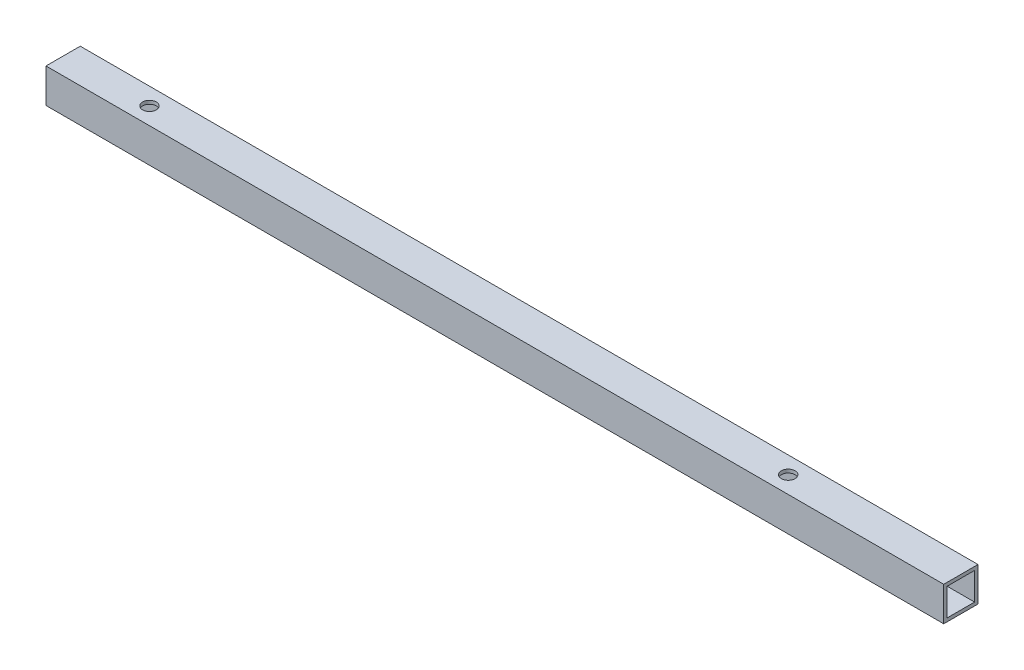
ISO-10303-21;
HEADER;
FILE_DESCRIPTION(('STEP AP214'),'2;1');
FILE_NAME('part.step','',(''),(''),'','','');
FILE_SCHEMA(('AUTOMOTIVE_DESIGN { 1 0 10303 214 1 1 1 1 }'));
ENDSEC;
DATA;
#1=APPLICATION_CONTEXT('core data for automotive mechanical design processes');
#2=APPLICATION_PROTOCOL_DEFINITION('international standard','automotive_design',2000,#1);
#3=PRODUCT_CONTEXT('',#1,'mechanical');
#4=PRODUCT('Part','Part','',(#3));
#5=PRODUCT_RELATED_PRODUCT_CATEGORY('part','',(#4));
#6=PRODUCT_DEFINITION_FORMATION('','',#4);
#7=PRODUCT_DEFINITION_CONTEXT('part definition',#1,'design');
#8=PRODUCT_DEFINITION('design','',#6,#7);
#9=PRODUCT_DEFINITION_SHAPE('','',#8);
#10=(LENGTH_UNIT() NAMED_UNIT(*) SI_UNIT(.MILLI.,.METRE.));
#11=(NAMED_UNIT(*) PLANE_ANGLE_UNIT() SI_UNIT($,.RADIAN.));
#12=(NAMED_UNIT(*) SI_UNIT($,.STERADIAN.) SOLID_ANGLE_UNIT());
#13=UNCERTAINTY_MEASURE_WITH_UNIT(LENGTH_MEASURE(1.E-05),#10,'distance_accuracy_value','');
#14=(GEOMETRIC_REPRESENTATION_CONTEXT(3) GLOBAL_UNCERTAINTY_ASSIGNED_CONTEXT((#13)) GLOBAL_UNIT_ASSIGNED_CONTEXT((#10,
#11,#12)) REPRESENTATION_CONTEXT('',''));
#15=CARTESIAN_POINT('',(0.,0.,0.));
#16=DIRECTION('',(0.,0.,1.));
#17=DIRECTION('',(1.,0.,0.));
#18=AXIS2_PLACEMENT_3D('',#15,#16,#17);
#19=CARTESIAN_POINT('',(104.,1.984375,-1.984375));
#20=DIRECTION('',(0.,0.,1.));
#21=DIRECTION('',(0.,-1.,0.));
#22=AXIS2_PLACEMENT_3D('',#19,#20,#21);
#23=PLANE('',#22);
#24=DIRECTION('',(0.,1.,0.));
#25=VECTOR('',#24,1.);
#26=CARTESIAN_POINT('',(0.,1.984375,-1.984375));
#27=LINE('',#26,#25);
#28=CARTESIAN_POINT('',(0.,-1.984375,-1.984375));
#29=VERTEX_POINT('',#28);
#30=CARTESIAN_POINT('',(0.,1.984375,-1.984375));
#31=VERTEX_POINT('',#30);
#32=EDGE_CURVE('E136',#29,#31,#27,.T.);
#33=ORIENTED_EDGE('',*,*,#32,.T.);
#34=DIRECTION('',(-1.,0.,0.));
#35=VECTOR('',#34,1.);
#36=CARTESIAN_POINT('',(104.,1.984375,-1.984375));
#37=LINE('',#36,#35);
#38=CARTESIAN_POINT('',(104.,1.984375,-1.984375));
#39=VERTEX_POINT('',#38);
#40=EDGE_CURVE('E11',#39,#31,#37,.T.);
#41=ORIENTED_EDGE('',*,*,#40,.F.);
#42=DIRECTION('',(0.,1.,0.));
#43=VECTOR('',#42,1.);
#44=CARTESIAN_POINT('',(104.,1.984375,-1.984375));
#45=LINE('',#44,#43);
#46=CARTESIAN_POINT('',(104.,-1.984375,-1.984375));
#47=VERTEX_POINT('',#46);
#48=EDGE_CURVE('E140',#47,#39,#45,.T.);
#49=ORIENTED_EDGE('',*,*,#48,.F.);
#50=DIRECTION('',(-1.,0.,0.));
#51=VECTOR('',#50,1.);
#52=CARTESIAN_POINT('',(104.,-1.984375,-1.984375));
#53=LINE('',#52,#51);
#54=EDGE_CURVE('E150',#47,#29,#53,.T.);
#55=ORIENTED_EDGE('',*,*,#54,.T.);
#56=EDGE_LOOP('',(#33,#41,#49,#55));
#57=FACE_BOUND('',#56,.T.);
#58=ADVANCED_FACE('F34',(#57),#23,.F.);
#59=CARTESIAN_POINT('',(104.,1.984375,1.984375));
#60=DIRECTION('',(0.,-1.,0.));
#61=DIRECTION('',(0.,0.,-1.));
#62=AXIS2_PLACEMENT_3D('',#59,#60,#61);
#63=PLANE('',#62);
#64=CARTESIAN_POINT('',(84.,1.984375,0.));
#65=DIRECTION('',(0.,1.,0.));
#66=DIRECTION('',(0.,0.,1.));
#67=AXIS2_PLACEMENT_3D('',#64,#65,#66);
#68=CIRCLE('',#67,0.793749999999993);
#69=CARTESIAN_POINT('',(84.,1.984375,0.793749999999993));
#70=VERTEX_POINT('',#69);
#71=EDGE_CURVE('E180',#70,#70,#68,.T.);
#72=ORIENTED_EDGE('',*,*,#71,.F.);
#73=EDGE_LOOP('',(#72));
#74=FACE_BOUND('',#73,.T.);
#75=CARTESIAN_POINT('',(10.,1.984375,0.));
#76=DIRECTION('',(0.,1.,0.));
#77=DIRECTION('',(0.,0.,1.));
#78=AXIS2_PLACEMENT_3D('',#75,#76,#77);
#79=CIRCLE('',#78,0.793749999999999);
#80=CARTESIAN_POINT('',(10.,1.984375,0.793749999999999));
#81=VERTEX_POINT('',#80);
#82=EDGE_CURVE('E171',#81,#81,#79,.T.);
#83=ORIENTED_EDGE('',*,*,#82,.F.);
#84=EDGE_LOOP('',(#83));
#85=FACE_BOUND('',#84,.T.);
#86=DIRECTION('',(0.,0.,1.));
#87=VECTOR('',#86,1.);
#88=CARTESIAN_POINT('',(0.,1.984375,1.984375));
#89=LINE('',#88,#87);
#90=CARTESIAN_POINT('',(0.,1.984375,1.984375));
#91=VERTEX_POINT('',#90);
#92=EDGE_CURVE('E153',#31,#91,#89,.T.);
#93=ORIENTED_EDGE('',*,*,#92,.T.);
#94=DIRECTION('',(-1.,0.,0.));
#95=VECTOR('',#94,1.);
#96=CARTESIAN_POINT('',(104.,1.984375,1.984375));
#97=LINE('',#96,#95);
#98=CARTESIAN_POINT('',(104.,1.984375,1.984375));
#99=VERTEX_POINT('',#98);
#100=EDGE_CURVE('E42',#99,#91,#97,.T.);
#101=ORIENTED_EDGE('',*,*,#100,.F.);
#102=DIRECTION('',(0.,0.,1.));
#103=VECTOR('',#102,1.);
#104=CARTESIAN_POINT('',(104.,1.984375,1.984375));
#105=LINE('',#104,#103);
#106=EDGE_CURVE('E143',#39,#99,#105,.T.);
#107=ORIENTED_EDGE('',*,*,#106,.F.);
#108=ORIENTED_EDGE('',*,*,#40,.T.);
#109=EDGE_LOOP('',(#93,#101,#107,#108));
#110=FACE_BOUND('',#109,.T.);
#111=ADVANCED_FACE('F206',(#74,#85,#110),#63,.F.);
#112=CARTESIAN_POINT('',(104.,1.984375,1.984375));
#113=DIRECTION('',(0.,0.,-1.));
#114=DIRECTION('',(0.,1.,0.));
#115=AXIS2_PLACEMENT_3D('',#112,#113,#114);
#116=PLANE('',#115);
#117=DIRECTION('',(0.,-1.,0.));
#118=VECTOR('',#117,1.);
#119=CARTESIAN_POINT('',(0.,1.984375,1.984375));
#120=LINE('',#119,#118);
#121=CARTESIAN_POINT('',(0.,-1.984375,1.984375));
#122=VERTEX_POINT('',#121);
#123=EDGE_CURVE('E155',#91,#122,#120,.T.);
#124=ORIENTED_EDGE('',*,*,#123,.T.);
#125=DIRECTION('',(-1.,0.,0.));
#126=VECTOR('',#125,1.);
#127=CARTESIAN_POINT('',(104.,-1.984375,1.984375));
#128=LINE('',#127,#126);
#129=CARTESIAN_POINT('',(104.,-1.984375,1.984375));
#130=VERTEX_POINT('',#129);
#131=EDGE_CURVE('E160',#130,#122,#128,.T.);
#132=ORIENTED_EDGE('',*,*,#131,.F.);
#133=DIRECTION('',(0.,-1.,0.));
#134=VECTOR('',#133,1.);
#135=CARTESIAN_POINT('',(104.,1.984375,1.984375));
#136=LINE('',#135,#134);
#137=EDGE_CURVE('E146',#99,#130,#136,.T.);
#138=ORIENTED_EDGE('',*,*,#137,.F.);
#139=ORIENTED_EDGE('',*,*,#100,.T.);
#140=EDGE_LOOP('',(#124,#132,#138,#139));
#141=FACE_BOUND('',#140,.T.);
#142=ADVANCED_FACE('F211',(#141),#116,.F.);
#143=CARTESIAN_POINT('',(104.,-1.984375,1.984375));
#144=DIRECTION('',(0.,1.,0.));
#145=DIRECTION('',(0.,0.,1.));
#146=AXIS2_PLACEMENT_3D('',#143,#144,#145);
#147=PLANE('',#146);
#148=CARTESIAN_POINT('',(84.,-1.984375,0.));
#149=DIRECTION('',(0.,1.,0.));
#150=DIRECTION('',(0.,0.,1.));
#151=AXIS2_PLACEMENT_3D('',#148,#149,#150);
#152=CIRCLE('',#151,0.793749999999993);
#153=CARTESIAN_POINT('',(84.,-1.984375,0.793749999999993));
#154=VERTEX_POINT('',#153);
#155=EDGE_CURVE('E183',#154,#154,#152,.T.);
#156=ORIENTED_EDGE('',*,*,#155,.T.);
#157=EDGE_LOOP('',(#156));
#158=FACE_BOUND('',#157,.T.);
#159=CARTESIAN_POINT('',(10.,-1.984375,0.));
#160=DIRECTION('',(0.,1.,0.));
#161=DIRECTION('',(0.,0.,1.));
#162=AXIS2_PLACEMENT_3D('',#159,#160,#161);
#163=CIRCLE('',#162,0.793749999999999);
#164=CARTESIAN_POINT('',(10.,-1.984375,0.793749999999999));
#165=VERTEX_POINT('',#164);
#166=EDGE_CURVE('E166',#165,#165,#163,.T.);
#167=ORIENTED_EDGE('',*,*,#166,.T.);
#168=EDGE_LOOP('',(#167));
#169=FACE_BOUND('',#168,.T.);
#170=DIRECTION('',(0.,0.,-1.));
#171=VECTOR('',#170,1.);
#172=CARTESIAN_POINT('',(0.,-1.984375,1.984375));
#173=LINE('',#172,#171);
#174=EDGE_CURVE('E144',#122,#29,#173,.T.);
#175=ORIENTED_EDGE('',*,*,#174,.T.);
#176=ORIENTED_EDGE('',*,*,#54,.F.);
#177=DIRECTION('',(0.,0.,-1.));
#178=VECTOR('',#177,1.);
#179=CARTESIAN_POINT('',(104.,-1.984375,1.984375));
#180=LINE('',#179,#178);
#181=EDGE_CURVE('E148',#130,#47,#180,.T.);
#182=ORIENTED_EDGE('',*,*,#181,.F.);
#183=ORIENTED_EDGE('',*,*,#131,.T.);
#184=EDGE_LOOP('',(#175,#176,#182,#183));
#185=FACE_BOUND('',#184,.T.);
#186=ADVANCED_FACE('F227',(#158,#169,#185),#147,.F.);
#187=CARTESIAN_POINT('',(104.,0.,0.));
#188=DIRECTION('',(1.,0.,0.));
#189=DIRECTION('',(0.,0.,-1.));
#190=AXIS2_PLACEMENT_3D('',#187,#188,#189);
#191=PLANE('',#190);
#192=DIRECTION('',(0.,1.,0.));
#193=VECTOR('',#192,1.);
#194=CARTESIAN_POINT('',(104.,1.5875,1.5875));
#195=LINE('',#194,#193);
#196=CARTESIAN_POINT('',(104.,-1.5875,1.5875));
#197=VERTEX_POINT('',#196);
#198=CARTESIAN_POINT('',(104.,1.5875,1.5875));
#199=VERTEX_POINT('',#198);
#200=EDGE_CURVE('E102',#197,#199,#195,.T.);
#201=ORIENTED_EDGE('',*,*,#200,.T.);
#202=DIRECTION('',(0.,0.,-1.));
#203=VECTOR('',#202,1.);
#204=CARTESIAN_POINT('',(104.,1.5875,-1.5875));
#205=LINE('',#204,#203);
#206=CARTESIAN_POINT('',(104.,1.5875,-1.5875));
#207=VERTEX_POINT('',#206);
#208=EDGE_CURVE('E111',#199,#207,#205,.T.);
#209=ORIENTED_EDGE('',*,*,#208,.T.);
#210=DIRECTION('',(0.,-1.,0.));
#211=VECTOR('',#210,1.);
#212=CARTESIAN_POINT('',(104.,1.5875,-1.5875));
#213=LINE('',#212,#211);
#214=CARTESIAN_POINT('',(104.,-1.5875,-1.5875));
#215=VERTEX_POINT('',#214);
#216=EDGE_CURVE('E50',#207,#215,#213,.T.);
#217=ORIENTED_EDGE('',*,*,#216,.T.);
#218=DIRECTION('',(0.,0.,1.));
#219=VECTOR('',#218,1.);
#220=CARTESIAN_POINT('',(104.,-1.5875,-1.5875));
#221=LINE('',#220,#219);
#222=EDGE_CURVE('E108',#215,#197,#221,.T.);
#223=ORIENTED_EDGE('',*,*,#222,.T.);
#224=EDGE_LOOP('',(#201,#209,#217,#223));
#225=FACE_BOUND('',#224,.T.);
#226=ORIENTED_EDGE('',*,*,#48,.T.);
#227=ORIENTED_EDGE('',*,*,#106,.T.);
#228=ORIENTED_EDGE('',*,*,#137,.T.);
#229=ORIENTED_EDGE('',*,*,#181,.T.);
#230=EDGE_LOOP('',(#226,#227,#228,#229));
#231=FACE_BOUND('',#230,.T.);
#232=ADVANCED_FACE('F115',(#225,#231),#191,.T.);
#233=CARTESIAN_POINT('',(0.,0.,0.));
#234=DIRECTION('',(1.,0.,0.));
#235=DIRECTION('',(0.,0.,-1.));
#236=AXIS2_PLACEMENT_3D('',#233,#234,#235);
#237=PLANE('',#236);
#238=DIRECTION('',(0.,0.,-1.));
#239=VECTOR('',#238,1.);
#240=CARTESIAN_POINT('',(0.,1.5875,-1.5875));
#241=LINE('',#240,#239);
#242=CARTESIAN_POINT('',(0.,1.5875,1.5875));
#243=VERTEX_POINT('',#242);
#244=CARTESIAN_POINT('',(0.,1.5875,-1.5875));
#245=VERTEX_POINT('',#244);
#246=EDGE_CURVE('E130',#243,#245,#241,.T.);
#247=ORIENTED_EDGE('',*,*,#246,.F.);
#248=DIRECTION('',(0.,1.,0.));
#249=VECTOR('',#248,1.);
#250=CARTESIAN_POINT('',(0.,1.5875,1.5875));
#251=LINE('',#250,#249);
#252=CARTESIAN_POINT('',(0.,-1.5875,1.5875));
#253=VERTEX_POINT('',#252);
#254=EDGE_CURVE('E58',#253,#243,#251,.T.);
#255=ORIENTED_EDGE('',*,*,#254,.F.);
#256=DIRECTION('',(0.,0.,1.));
#257=VECTOR('',#256,1.);
#258=CARTESIAN_POINT('',(0.,-1.5875,-1.5875));
#259=LINE('',#258,#257);
#260=CARTESIAN_POINT('',(0.,-1.5875,-1.5875));
#261=VERTEX_POINT('',#260);
#262=EDGE_CURVE('E118',#261,#253,#259,.T.);
#263=ORIENTED_EDGE('',*,*,#262,.F.);
#264=DIRECTION('',(0.,-1.,0.));
#265=VECTOR('',#264,1.);
#266=CARTESIAN_POINT('',(0.,1.5875,-1.5875));
#267=LINE('',#266,#265);
#268=EDGE_CURVE('E121',#245,#261,#267,.T.);
#269=ORIENTED_EDGE('',*,*,#268,.F.);
#270=EDGE_LOOP('',(#247,#255,#263,#269));
#271=FACE_BOUND('',#270,.T.);
#272=ORIENTED_EDGE('',*,*,#32,.F.);
#273=ORIENTED_EDGE('',*,*,#174,.F.);
#274=ORIENTED_EDGE('',*,*,#123,.F.);
#275=ORIENTED_EDGE('',*,*,#92,.F.);
#276=EDGE_LOOP('',(#272,#273,#274,#275));
#277=FACE_BOUND('',#276,.T.);
#278=ADVANCED_FACE('F219',(#271,#277),#237,.F.);
#279=CARTESIAN_POINT('',(104.,1.5875,1.5875));
#280=DIRECTION('',(0.,0.,1.));
#281=DIRECTION('',(0.,-1.,0.));
#282=AXIS2_PLACEMENT_3D('',#279,#280,#281);
#283=PLANE('',#282);
#284=ORIENTED_EDGE('',*,*,#254,.T.);
#285=DIRECTION('',(-1.,0.,0.));
#286=VECTOR('',#285,1.);
#287=CARTESIAN_POINT('',(104.,1.5875,1.5875));
#288=LINE('',#287,#286);
#289=EDGE_CURVE('E98',#199,#243,#288,.T.);
#290=ORIENTED_EDGE('',*,*,#289,.F.);
#291=ORIENTED_EDGE('',*,*,#200,.F.);
#292=DIRECTION('',(-1.,0.,0.));
#293=VECTOR('',#292,1.);
#294=CARTESIAN_POINT('',(104.,-1.5875,1.5875));
#295=LINE('',#294,#293);
#296=EDGE_CURVE('E134',#197,#253,#295,.T.);
#297=ORIENTED_EDGE('',*,*,#296,.T.);
#298=EDGE_LOOP('',(#284,#290,#291,#297));
#299=FACE_BOUND('',#298,.T.);
#300=ADVANCED_FACE('F100',(#299),#283,.F.);
#301=CARTESIAN_POINT('',(104.,-1.5875,-1.5875));
#302=DIRECTION('',(0.,-1.,0.));
#303=DIRECTION('',(0.,0.,-1.));
#304=AXIS2_PLACEMENT_3D('',#301,#302,#303);
#305=PLANE('',#304);
#306=CARTESIAN_POINT('',(84.,-1.5875,0.));
#307=DIRECTION('',(0.,-1.,0.));
#308=DIRECTION('',(0.,0.,-1.));
#309=AXIS2_PLACEMENT_3D('',#306,#307,#308);
#310=CIRCLE('',#309,0.793749999999993);
#311=CARTESIAN_POINT('',(84.,-1.5875,-0.793749999999993));
#312=VERTEX_POINT('',#311);
#313=EDGE_CURVE('E176',#312,#312,#310,.T.);
#314=ORIENTED_EDGE('',*,*,#313,.T.);
#315=EDGE_LOOP('',(#314));
#316=FACE_BOUND('',#315,.T.);
#317=CARTESIAN_POINT('',(10.,-1.5875,0.));
#318=DIRECTION('',(0.,-1.,0.));
#319=DIRECTION('',(0.,0.,-1.));
#320=AXIS2_PLACEMENT_3D('',#317,#318,#319);
#321=CIRCLE('',#320,0.793749999999999);
#322=CARTESIAN_POINT('',(10.,-1.5875,-0.793749999999999));
#323=VERTEX_POINT('',#322);
#324=EDGE_CURVE('E124',#323,#323,#321,.T.);
#325=ORIENTED_EDGE('',*,*,#324,.T.);
#326=EDGE_LOOP('',(#325));
#327=FACE_BOUND('',#326,.T.);
#328=ORIENTED_EDGE('',*,*,#262,.T.);
#329=ORIENTED_EDGE('',*,*,#296,.F.);
#330=ORIENTED_EDGE('',*,*,#222,.F.);
#331=DIRECTION('',(-1.,0.,0.));
#332=VECTOR('',#331,1.);
#333=CARTESIAN_POINT('',(104.,-1.5875,-1.5875));
#334=LINE('',#333,#332);
#335=EDGE_CURVE('E137',#215,#261,#334,.T.);
#336=ORIENTED_EDGE('',*,*,#335,.T.);
#337=EDGE_LOOP('',(#328,#329,#330,#336));
#338=FACE_BOUND('',#337,.T.);
#339=ADVANCED_FACE('F243',(#316,#327,#338),#305,.F.);
#340=CARTESIAN_POINT('',(104.,1.5875,-1.5875));
#341=DIRECTION('',(0.,0.,-1.));
#342=DIRECTION('',(0.,1.,0.));
#343=AXIS2_PLACEMENT_3D('',#340,#341,#342);
#344=PLANE('',#343);
#345=ORIENTED_EDGE('',*,*,#268,.T.);
#346=ORIENTED_EDGE('',*,*,#335,.F.);
#347=ORIENTED_EDGE('',*,*,#216,.F.);
#348=DIRECTION('',(-1.,0.,0.));
#349=VECTOR('',#348,1.);
#350=CARTESIAN_POINT('',(104.,1.5875,-1.5875));
#351=LINE('',#350,#349);
#352=EDGE_CURVE('E107',#207,#245,#351,.T.);
#353=ORIENTED_EDGE('',*,*,#352,.T.);
#354=EDGE_LOOP('',(#345,#346,#347,#353));
#355=FACE_BOUND('',#354,.T.);
#356=ADVANCED_FACE('F246',(#355),#344,.F.);
#357=CARTESIAN_POINT('',(104.,1.5875,-1.5875));
#358=DIRECTION('',(0.,1.,0.));
#359=DIRECTION('',(0.,0.,1.));
#360=AXIS2_PLACEMENT_3D('',#357,#358,#359);
#361=PLANE('',#360);
#362=CARTESIAN_POINT('',(84.,1.5875,0.));
#363=DIRECTION('',(0.,1.,0.));
#364=DIRECTION('',(0.,0.,1.));
#365=AXIS2_PLACEMENT_3D('',#362,#363,#364);
#366=CIRCLE('',#365,0.793749999999993);
#367=CARTESIAN_POINT('',(84.,1.5875,0.793749999999993));
#368=VERTEX_POINT('',#367);
#369=EDGE_CURVE('E37',#368,#368,#366,.T.);
#370=ORIENTED_EDGE('',*,*,#369,.T.);
#371=EDGE_LOOP('',(#370));
#372=FACE_BOUND('',#371,.T.);
#373=CARTESIAN_POINT('',(10.,1.5875,0.));
#374=DIRECTION('',(0.,1.,0.));
#375=DIRECTION('',(0.,0.,1.));
#376=AXIS2_PLACEMENT_3D('',#373,#374,#375);
#377=CIRCLE('',#376,0.793749999999999);
#378=CARTESIAN_POINT('',(10.,1.5875,0.793749999999999));
#379=VERTEX_POINT('',#378);
#380=EDGE_CURVE('E164',#379,#379,#377,.T.);
#381=ORIENTED_EDGE('',*,*,#380,.T.);
#382=EDGE_LOOP('',(#381));
#383=FACE_BOUND('',#382,.T.);
#384=ORIENTED_EDGE('',*,*,#246,.T.);
#385=ORIENTED_EDGE('',*,*,#352,.F.);
#386=ORIENTED_EDGE('',*,*,#208,.F.);
#387=ORIENTED_EDGE('',*,*,#289,.T.);
#388=EDGE_LOOP('',(#384,#385,#386,#387));
#389=FACE_BOUND('',#388,.T.);
#390=ADVANCED_FACE('F112',(#372,#383,#389),#361,.F.);
#391=CARTESIAN_POINT('',(10.,-1.984375,0.));
#392=DIRECTION('',(0.,1.,0.));
#393=DIRECTION('',(0.,0.,1.));
#394=AXIS2_PLACEMENT_3D('',#391,#392,#393);
#395=CYLINDRICAL_SURFACE('',#394,0.793749999999999);
#396=ORIENTED_EDGE('',*,*,#82,.T.);
#397=EDGE_LOOP('',(#396));
#398=FACE_BOUND('',#397,.T.);
#399=ORIENTED_EDGE('',*,*,#380,.F.);
#400=EDGE_LOOP('',(#399));
#401=FACE_BOUND('',#400,.T.);
#402=ADVANCED_FACE('F202',(#398,#401),#395,.F.);
#403=ORIENTED_EDGE('',*,*,#166,.F.);
#404=EDGE_LOOP('',(#403));
#405=FACE_BOUND('',#404,.T.);
#406=ORIENTED_EDGE('',*,*,#324,.F.);
#407=EDGE_LOOP('',(#406));
#408=FACE_BOUND('',#407,.T.);
#409=ADVANCED_FACE('F194',(#405,#408),#395,.F.);
#410=CARTESIAN_POINT('',(84.,-1.984375,0.));
#411=DIRECTION('',(0.,1.,0.));
#412=DIRECTION('',(0.,0.,1.));
#413=AXIS2_PLACEMENT_3D('',#410,#411,#412);
#414=CYLINDRICAL_SURFACE('',#413,0.793749999999993);
#415=ORIENTED_EDGE('',*,*,#71,.T.);
#416=EDGE_LOOP('',(#415));
#417=FACE_BOUND('',#416,.T.);
#418=ORIENTED_EDGE('',*,*,#369,.F.);
#419=EDGE_LOOP('',(#418));
#420=FACE_BOUND('',#419,.T.);
#421=ADVANCED_FACE('F191',(#417,#420),#414,.F.);
#422=ORIENTED_EDGE('',*,*,#155,.F.);
#423=EDGE_LOOP('',(#422));
#424=FACE_BOUND('',#423,.T.);
#425=ORIENTED_EDGE('',*,*,#313,.F.);
#426=EDGE_LOOP('',(#425));
#427=FACE_BOUND('',#426,.T.);
#428=ADVANCED_FACE('F193',(#424,#427),#414,.F.);
#429=CLOSED_SHELL('',(#58,#111,#142,#186,#232,#278,#300,#339,#356,#390,#402,#409,#421,#428));
#430=MANIFOLD_SOLID_BREP('B2',#429);
#431=ADVANCED_BREP_SHAPE_REPRESENTATION('',(#18,#430),#14);
#432=SHAPE_DEFINITION_REPRESENTATION(#9,#431);
ENDSEC;
END-ISO-10303-21;
